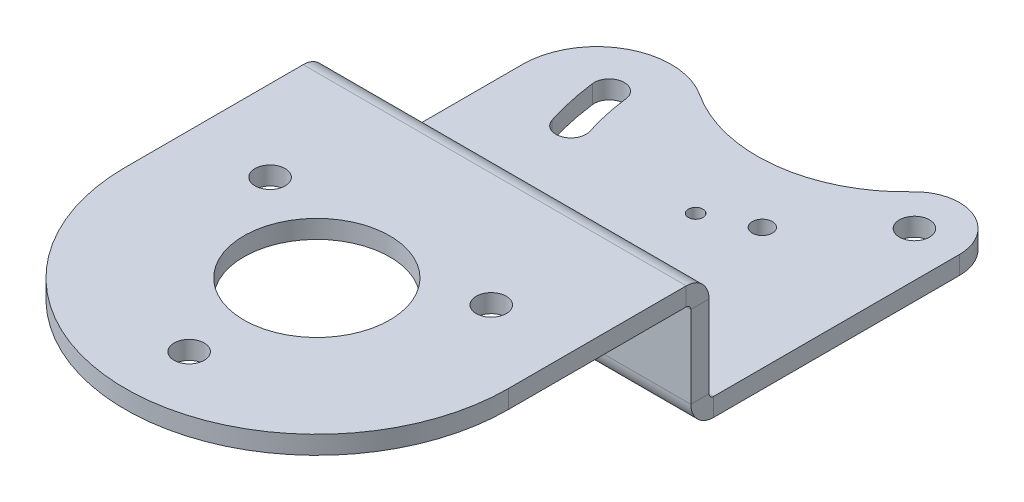
ISO-10303-21;
HEADER;
FILE_DESCRIPTION(('STEP AP214'),'2;1');
FILE_NAME('part.step','',(''),(''),'','','');
FILE_SCHEMA(('AUTOMOTIVE_DESIGN { 1 0 10303 214 1 1 1 1 }'));
ENDSEC;
DATA;
#1=APPLICATION_CONTEXT('core data for automotive mechanical design processes');
#2=APPLICATION_PROTOCOL_DEFINITION('international standard','automotive_design',2000,#1);
#3=PRODUCT_CONTEXT('',#1,'mechanical');
#4=PRODUCT('Part','Part','',(#3));
#5=PRODUCT_RELATED_PRODUCT_CATEGORY('part','',(#4));
#6=PRODUCT_DEFINITION_FORMATION('','',#4);
#7=PRODUCT_DEFINITION_CONTEXT('part definition',#1,'design');
#8=PRODUCT_DEFINITION('design','',#6,#7);
#9=PRODUCT_DEFINITION_SHAPE('','',#8);
#10=(LENGTH_UNIT() NAMED_UNIT(*) SI_UNIT(.MILLI.,.METRE.));
#11=(NAMED_UNIT(*) PLANE_ANGLE_UNIT() SI_UNIT($,.RADIAN.));
#12=(NAMED_UNIT(*) SI_UNIT($,.STERADIAN.) SOLID_ANGLE_UNIT());
#13=UNCERTAINTY_MEASURE_WITH_UNIT(LENGTH_MEASURE(1.E-05),#10,'distance_accuracy_value','');
#14=(GEOMETRIC_REPRESENTATION_CONTEXT(3) GLOBAL_UNCERTAINTY_ASSIGNED_CONTEXT((#13)) GLOBAL_UNIT_ASSIGNED_CONTEXT((#10,
#11,#12)) REPRESENTATION_CONTEXT('',''));
#15=CARTESIAN_POINT('',(0.,0.,0.));
#16=DIRECTION('',(0.,0.,1.));
#17=DIRECTION('',(1.,0.,0.));
#18=AXIS2_PLACEMENT_3D('',#15,#16,#17);
#19=CARTESIAN_POINT('',(21.,-14.,-22.));
#20=DIRECTION('',(-1.,0.,0.));
#21=DIRECTION('',(0.,0.,1.));
#22=AXIS2_PLACEMENT_3D('',#19,#20,#21);
#23=PLANE('',#22);
#24=DIRECTION('',(0.,1.,0.));
#25=VECTOR('',#24,1.);
#26=CARTESIAN_POINT('',(21.,-12.,-49.4549388473485));
#27=LINE('',#26,#25);
#28=CARTESIAN_POINT('',(21.,-12.,-49.4549388473485));
#29=VERTEX_POINT('',#28);
#30=CARTESIAN_POINT('',(21.,-14.,-49.4549388473485));
#31=VERTEX_POINT('',#30);
#32=EDGE_CURVE('E141',#29,#31,#27,.F.);
#33=ORIENTED_EDGE('',*,*,#32,.F.);
#34=DIRECTION('',(0.,0.,1.));
#35=VECTOR('',#34,1.);
#36=CARTESIAN_POINT('',(21.,-12.,-22.));
#37=LINE('',#36,#35);
#38=CARTESIAN_POINT('',(21.,-12.,-22.5));
#39=VERTEX_POINT('',#38);
#40=EDGE_CURVE('E173',#29,#39,#37,.T.);
#41=ORIENTED_EDGE('',*,*,#40,.T.);
#42=DIRECTION('',(0.,-1.,0.));
#43=VECTOR('',#42,1.);
#44=CARTESIAN_POINT('',(21.,-12.,-22.5));
#45=LINE('',#44,#43);
#46=CARTESIAN_POINT('',(21.,-14.,-22.5));
#47=VERTEX_POINT('',#46);
#48=EDGE_CURVE('E165',#39,#47,#45,.T.);
#49=ORIENTED_EDGE('',*,*,#48,.T.);
#50=DIRECTION('',(0.,0.,1.));
#51=VECTOR('',#50,1.);
#52=CARTESIAN_POINT('',(21.,-14.,-22.));
#53=LINE('',#52,#51);
#54=EDGE_CURVE('E158',#31,#47,#53,.T.);
#55=ORIENTED_EDGE('',*,*,#54,.F.);
#56=EDGE_LOOP('',(#33,#41,#49,#55));
#57=FACE_BOUND('',#56,.T.);
#58=ADVANCED_FACE('F17',(#57),#23,.F.);
#59=CARTESIAN_POINT('',(-21.,-14.,-22.));
#60=DIRECTION('',(0.,1.,0.));
#61=DIRECTION('',(0.,0.,1.));
#62=AXIS2_PLACEMENT_3D('',#59,#60,#61);
#63=PLANE('',#62);
#64=CARTESIAN_POINT('',(7.61949930145722,-14.,-41.2234289049806));
#65=DIRECTION('',(0.,1.,0.));
#66=DIRECTION('',(0.,0.,1.));
#67=AXIS2_PLACEMENT_3D('',#64,#65,#66);
#68=CIRCLE('',#67,1.09999999999997);
#69=CARTESIAN_POINT('',(7.61949930145722,-14.,-40.1234289049807));
#70=VERTEX_POINT('',#69);
#71=EDGE_CURVE('E619',#70,#70,#68,.T.);
#72=ORIENTED_EDGE('',*,*,#71,.T.);
#73=EDGE_LOOP('',(#72));
#74=FACE_BOUND('',#73,.T.);
#75=CARTESIAN_POINT('',(2.63480647275565,-14.,-38.8990284654068));
#76=DIRECTION('',(0.,1.,0.));
#77=DIRECTION('',(0.,0.,1.));
#78=AXIS2_PLACEMENT_3D('',#75,#76,#77);
#79=CIRCLE('',#78,0.799999999999989);
#80=CARTESIAN_POINT('',(2.63480647275565,-14.,-38.0990284654068));
#81=VERTEX_POINT('',#80);
#82=EDGE_CURVE('E623',#81,#81,#79,.T.);
#83=ORIENTED_EDGE('',*,*,#82,.T.);
#84=EDGE_LOOP('',(#83));
#85=FACE_BOUND('',#84,.T.);
#86=CARTESIAN_POINT('',(16.0688837074964,-14.,-49.4549388473485));
#87=DIRECTION('',(0.,1.,0.));
#88=DIRECTION('',(0.,0.,1.));
#89=AXIS2_PLACEMENT_3D('',#86,#87,#88);
#90=CIRCLE('',#89,1.65);
#91=CARTESIAN_POINT('',(16.0688837074964,-14.,-47.8049388473485));
#92=VERTEX_POINT('',#91);
#93=EDGE_CURVE('E673',#92,#92,#90,.T.);
#94=ORIENTED_EDGE('',*,*,#93,.T.);
#95=EDGE_LOOP('',(#94));
#96=FACE_BOUND('',#95,.T.);
#97=CARTESIAN_POINT('',(-13.7029628266318,-14.,-45.7620871107737));
#98=DIRECTION('',(0.,1.,0.));
#99=DIRECTION('',(0.,0.,1.));
#100=AXIS2_PLACEMENT_3D('',#97,#98,#99);
#101=CIRCLE('',#100,1.65);
#102=CARTESIAN_POINT('',(-12.0655112672547,-14.,-45.9651939562853));
#103=VERTEX_POINT('',#102);
#104=CARTESIAN_POINT('',(-15.3404143860089,-14.,-45.5589802652621));
#105=VERTEX_POINT('',#104);
#106=EDGE_CURVE('E651',#103,#105,#101,.T.);
#107=ORIENTED_EDGE('',*,*,#106,.T.);
#108=CARTESIAN_POINT('',(16.0688837074964,-14.,-49.4549388473485));
#109=DIRECTION('',(0.,1.,0.));
#110=DIRECTION('',(0.,0.,1.));
#111=AXIS2_PLACEMENT_3D('',#108,#109,#110);
#112=CIRCLE('',#111,31.65);
#113=CARTESIAN_POINT('',(-14.101311819247,-14.,-39.8903268908666));
#114=VERTEX_POINT('',#113);
#115=EDGE_CURVE('E643',#105,#114,#112,.T.);
#116=ORIENTED_EDGE('',*,*,#115,.T.);
#117=CARTESIAN_POINT('',(-12.528458024014,-14.,-40.3889559502093));
#118=DIRECTION('',(0.,1.,0.));
#119=DIRECTION('',(0.,0.,1.));
#120=AXIS2_PLACEMENT_3D('',#117,#118,#119);
#121=CIRCLE('',#120,1.65);
#122=CARTESIAN_POINT('',(-10.9556042287809,-14.,-40.8875850095519));
#123=VERTEX_POINT('',#122);
#124=EDGE_CURVE('E646',#114,#123,#121,.T.);
#125=ORIENTED_EDGE('',*,*,#124,.T.);
#126=CARTESIAN_POINT('',(16.0688837074964,-14.,-49.4549388473485));
#127=DIRECTION('',(0.,-1.,0.));
#128=DIRECTION('',(0.,0.,1.));
#129=AXIS2_PLACEMENT_3D('',#126,#127,#128);
#130=CIRCLE('',#129,28.35);
#131=EDGE_CURVE('E40',#123,#103,#130,.T.);
#132=ORIENTED_EDGE('',*,*,#131,.T.);
#133=EDGE_LOOP('',(#107,#116,#125,#132));
#134=FACE_BOUND('',#133,.T.);
#135=CARTESIAN_POINT('',(16.0688837074964,-14.,-49.4549388473485));
#136=DIRECTION('',(0.,-1.,0.));
#137=DIRECTION('',(0.,0.,-1.));
#138=AXIS2_PLACEMENT_3D('',#135,#136,#137);
#139=CIRCLE('',#138,4.93111629250366);
#140=CARTESIAN_POINT('',(12.4802044217859,-14.,-52.8368449481307));
#141=VERTEX_POINT('',#140);
#142=EDGE_CURVE('E145',#141,#31,#139,.T.);
#143=ORIENTED_EDGE('',*,*,#142,.T.);
#144=ORIENTED_EDGE('',*,*,#54,.T.);
#145=DIRECTION('',(1.,0.,0.));
#146=VECTOR('',#145,1.);
#147=CARTESIAN_POINT('',(-21.,-14.,-22.5));
#148=LINE('',#147,#146);
#149=CARTESIAN_POINT('',(-21.,-14.,-22.5));
#150=VERTEX_POINT('',#149);
#151=EDGE_CURVE('E180',#150,#47,#148,.T.);
#152=ORIENTED_EDGE('',*,*,#151,.F.);
#153=DIRECTION('',(0.,0.,-1.));
#154=VECTOR('',#153,1.);
#155=CARTESIAN_POINT('',(-21.,-14.,-70.));
#156=LINE('',#155,#154);
#157=CARTESIAN_POINT('',(-21.,-14.,-43.5542430095953));
#158=VERTEX_POINT('',#157);
#159=EDGE_CURVE('E167',#150,#158,#156,.T.);
#160=ORIENTED_EDGE('',*,*,#159,.T.);
#161=CARTESIAN_POINT('',(-12.8510606600122,-14.,-43.5542430095953));
#162=DIRECTION('',(0.,-1.,0.));
#163=DIRECTION('',(0.,0.,-1.));
#164=AXIS2_PLACEMENT_3D('',#161,#162,#163);
#165=CIRCLE('',#164,8.14893933998781);
#166=CARTESIAN_POINT('',(-8.38641685903616,-14.,-50.3712928185088));
#167=VERTEX_POINT('',#166);
#168=EDGE_CURVE('E631',#158,#167,#165,.T.);
#169=ORIENTED_EDGE('',*,*,#168,.T.);
#170=CARTESIAN_POINT('',(0.575665220033303,-14.,-64.0554662146556));
#171=DIRECTION('',(0.,1.,0.));
#172=DIRECTION('',(0.,0.,1.));
#173=AXIS2_PLACEMENT_3D('',#170,#171,#172);
#174=CIRCLE('',#173,16.3577356846169);
#175=EDGE_CURVE('E161',#167,#141,#174,.T.);
#176=ORIENTED_EDGE('',*,*,#175,.T.);
#177=EDGE_LOOP('',(#143,#144,#152,#160,#169,#176));
#178=FACE_BOUND('',#177,.T.);
#179=ADVANCED_FACE('F156',(#74,#85,#96,#134,#178),#63,.F.);
#180=CARTESIAN_POINT('',(-21.,-12.,-22.));
#181=DIRECTION('',(0.,1.,0.));
#182=DIRECTION('',(0.,0.,1.));
#183=AXIS2_PLACEMENT_3D('',#180,#181,#182);
#184=PLANE('',#183);
#185=CARTESIAN_POINT('',(7.61949930145722,-12.,-41.2234289049806));
#186=DIRECTION('',(0.,1.,0.));
#187=DIRECTION('',(0.,0.,1.));
#188=AXIS2_PLACEMENT_3D('',#185,#186,#187);
#189=CIRCLE('',#188,1.09999999999998);
#190=CARTESIAN_POINT('',(7.61949930145722,-12.,-40.1234289049807));
#191=VERTEX_POINT('',#190);
#192=EDGE_CURVE('E616',#191,#191,#189,.T.);
#193=ORIENTED_EDGE('',*,*,#192,.F.);
#194=EDGE_LOOP('',(#193));
#195=FACE_BOUND('',#194,.T.);
#196=CARTESIAN_POINT('',(2.63480647275565,-12.,-38.8990284654068));
#197=DIRECTION('',(0.,1.,0.));
#198=DIRECTION('',(0.,0.,1.));
#199=AXIS2_PLACEMENT_3D('',#196,#197,#198);
#200=CIRCLE('',#199,0.79999999999999);
#201=CARTESIAN_POINT('',(2.63480647275565,-12.,-38.0990284654068));
#202=VERTEX_POINT('',#201);
#203=EDGE_CURVE('E620',#202,#202,#200,.T.);
#204=ORIENTED_EDGE('',*,*,#203,.F.);
#205=EDGE_LOOP('',(#204));
#206=FACE_BOUND('',#205,.T.);
#207=CARTESIAN_POINT('',(16.0688837074964,-12.,-49.4549388473485));
#208=DIRECTION('',(0.,1.,0.));
#209=DIRECTION('',(0.,0.,1.));
#210=AXIS2_PLACEMENT_3D('',#207,#208,#209);
#211=CIRCLE('',#210,1.65);
#212=CARTESIAN_POINT('',(16.0688837074964,-12.,-47.8049388473485));
#213=VERTEX_POINT('',#212);
#214=EDGE_CURVE('E666',#213,#213,#211,.T.);
#215=ORIENTED_EDGE('',*,*,#214,.F.);
#216=EDGE_LOOP('',(#215));
#217=FACE_BOUND('',#216,.T.);
#218=CARTESIAN_POINT('',(16.0688837074964,-12.,-49.4549388473485));
#219=DIRECTION('',(0.,1.,0.));
#220=DIRECTION('',(0.,0.,1.));
#221=AXIS2_PLACEMENT_3D('',#218,#219,#220);
#222=CIRCLE('',#221,31.65);
#223=CARTESIAN_POINT('',(-15.3404143860089,-12.,-45.5589802652621));
#224=VERTEX_POINT('',#223);
#225=CARTESIAN_POINT('',(-14.101311819247,-12.,-39.8903268908666));
#226=VERTEX_POINT('',#225);
#227=EDGE_CURVE('E641',#224,#226,#222,.T.);
#228=ORIENTED_EDGE('',*,*,#227,.F.);
#229=CARTESIAN_POINT('',(-13.7029628266318,-12.,-45.7620871107737));
#230=DIRECTION('',(0.,1.,0.));
#231=DIRECTION('',(0.,0.,1.));
#232=AXIS2_PLACEMENT_3D('',#229,#230,#231);
#233=CIRCLE('',#232,1.65);
#234=CARTESIAN_POINT('',(-12.0655112672547,-12.,-45.9651939562853));
#235=VERTEX_POINT('',#234);
#236=EDGE_CURVE('E647',#235,#224,#233,.T.);
#237=ORIENTED_EDGE('',*,*,#236,.F.);
#238=CARTESIAN_POINT('',(16.0688837074964,-12.,-49.4549388473485));
#239=DIRECTION('',(0.,-1.,0.));
#240=DIRECTION('',(0.,0.,1.));
#241=AXIS2_PLACEMENT_3D('',#238,#239,#240);
#242=CIRCLE('',#241,28.35);
#243=CARTESIAN_POINT('',(-10.9556042287809,-12.,-40.8875850095519));
#244=VERTEX_POINT('',#243);
#245=EDGE_CURVE('E659',#244,#235,#242,.T.);
#246=ORIENTED_EDGE('',*,*,#245,.F.);
#247=CARTESIAN_POINT('',(-12.528458024014,-12.,-40.3889559502093));
#248=DIRECTION('',(0.,1.,0.));
#249=DIRECTION('',(0.,0.,1.));
#250=AXIS2_PLACEMENT_3D('',#247,#248,#249);
#251=CIRCLE('',#250,1.65);
#252=EDGE_CURVE('E656',#226,#244,#251,.T.);
#253=ORIENTED_EDGE('',*,*,#252,.F.);
#254=EDGE_LOOP('',(#228,#237,#246,#253));
#255=FACE_BOUND('',#254,.T.);
#256=ORIENTED_EDGE('',*,*,#40,.F.);
#257=CARTESIAN_POINT('',(16.0688837074964,-12.,-49.4549388473485));
#258=DIRECTION('',(0.,-1.,0.));
#259=DIRECTION('',(0.,0.,1.));
#260=AXIS2_PLACEMENT_3D('',#257,#258,#259);
#261=CIRCLE('',#260,4.93111629250366);
#262=CARTESIAN_POINT('',(12.4802044217859,-12.,-52.8368449481307));
#263=VERTEX_POINT('',#262);
#264=EDGE_CURVE('E148',#263,#29,#261,.T.);
#265=ORIENTED_EDGE('',*,*,#264,.F.);
#266=CARTESIAN_POINT('',(0.575665220033303,-12.,-64.0554662146556));
#267=DIRECTION('',(0.,1.,0.));
#268=DIRECTION('',(0.,0.,1.));
#269=AXIS2_PLACEMENT_3D('',#266,#267,#268);
#270=CIRCLE('',#269,16.3577356846169);
#271=CARTESIAN_POINT('',(-8.38641685903616,-12.,-50.3712928185088));
#272=VERTEX_POINT('',#271);
#273=EDGE_CURVE('E634',#272,#263,#270,.T.);
#274=ORIENTED_EDGE('',*,*,#273,.F.);
#275=CARTESIAN_POINT('',(-12.8510606600122,-12.,-43.5542430095953));
#276=DIRECTION('',(0.,-1.,0.));
#277=DIRECTION('',(0.,0.,1.));
#278=AXIS2_PLACEMENT_3D('',#275,#276,#277);
#279=CIRCLE('',#278,8.14893933998781);
#280=CARTESIAN_POINT('',(-21.,-12.,-43.5542430095953));
#281=VERTEX_POINT('',#280);
#282=EDGE_CURVE('E628',#281,#272,#279,.T.);
#283=ORIENTED_EDGE('',*,*,#282,.F.);
#284=DIRECTION('',(0.,0.,-1.));
#285=VECTOR('',#284,1.);
#286=CARTESIAN_POINT('',(-21.,-12.,-70.));
#287=LINE('',#286,#285);
#288=CARTESIAN_POINT('',(-21.,-12.,-22.5));
#289=VERTEX_POINT('',#288);
#290=EDGE_CURVE('E177',#289,#281,#287,.T.);
#291=ORIENTED_EDGE('',*,*,#290,.F.);
#292=DIRECTION('',(-1.,0.,0.));
#293=VECTOR('',#292,1.);
#294=CARTESIAN_POINT('',(21.,-12.,-22.5));
#295=LINE('',#294,#293);
#296=EDGE_CURVE('E678',#39,#289,#295,.T.);
#297=ORIENTED_EDGE('',*,*,#296,.F.);
#298=EDGE_LOOP('',(#256,#265,#274,#283,#291,#297));
#299=FACE_BOUND('',#298,.T.);
#300=ADVANCED_FACE('F330',(#195,#206,#217,#255,#299),#184,.T.);
#301=CARTESIAN_POINT('',(21.,-12.,-22.));
#302=DIRECTION('',(-1.,0.,0.));
#303=DIRECTION('',(0.,0.,1.));
#304=AXIS2_PLACEMENT_3D('',#301,#302,#303);
#305=PLANE('',#304);
#306=DIRECTION('',(0.,0.,1.));
#307=VECTOR('',#306,1.);
#308=CARTESIAN_POINT('',(21.,-11.5,-22.));
#309=LINE('',#308,#307);
#310=CARTESIAN_POINT('',(21.,-11.5,-22.));
#311=VERTEX_POINT('',#310);
#312=CARTESIAN_POINT('',(21.,-11.5,-20.));
#313=VERTEX_POINT('',#312);
#314=EDGE_CURVE('E196',#311,#313,#309,.T.);
#315=ORIENTED_EDGE('',*,*,#314,.F.);
#316=DIRECTION('',(0.,-1.,0.));
#317=VECTOR('',#316,1.);
#318=CARTESIAN_POINT('',(21.,-12.,-22.));
#319=LINE('',#318,#317);
#320=CARTESIAN_POINT('',(21.,-2.5,-22.));
#321=VERTEX_POINT('',#320);
#322=EDGE_CURVE('E213',#321,#311,#319,.T.);
#323=ORIENTED_EDGE('',*,*,#322,.F.);
#324=DIRECTION('',(0.,0.,-1.));
#325=VECTOR('',#324,1.);
#326=CARTESIAN_POINT('',(21.,-2.5,-20.));
#327=LINE('',#326,#325);
#328=CARTESIAN_POINT('',(21.,-2.5,-20.));
#329=VERTEX_POINT('',#328);
#330=EDGE_CURVE('E204',#329,#321,#327,.T.);
#331=ORIENTED_EDGE('',*,*,#330,.F.);
#332=DIRECTION('',(0.,-1.,0.));
#333=VECTOR('',#332,1.);
#334=CARTESIAN_POINT('',(21.,-12.,-20.));
#335=LINE('',#334,#333);
#336=EDGE_CURVE('E212',#329,#313,#335,.T.);
#337=ORIENTED_EDGE('',*,*,#336,.T.);
#338=EDGE_LOOP('',(#315,#323,#331,#337));
#339=FACE_BOUND('',#338,.T.);
#340=ADVANCED_FACE('F366',(#339),#305,.F.);
#341=CARTESIAN_POINT('',(-21.,-2.,-22.));
#342=DIRECTION('',(1.,0.,0.));
#343=DIRECTION('',(0.,0.,-1.));
#344=AXIS2_PLACEMENT_3D('',#341,#342,#343);
#345=PLANE('',#344);
#346=DIRECTION('',(0.,0.,1.));
#347=VECTOR('',#346,1.);
#348=CARTESIAN_POINT('',(-21.,-11.5,-22.));
#349=LINE('',#348,#347);
#350=CARTESIAN_POINT('',(-21.,-11.5,-22.));
#351=VERTEX_POINT('',#350);
#352=CARTESIAN_POINT('',(-21.,-11.5,-20.));
#353=VERTEX_POINT('',#352);
#354=EDGE_CURVE('E189',#351,#353,#349,.T.);
#355=ORIENTED_EDGE('',*,*,#354,.T.);
#356=DIRECTION('',(0.,1.,0.));
#357=VECTOR('',#356,1.);
#358=CARTESIAN_POINT('',(-21.,-2.,-20.));
#359=LINE('',#358,#357);
#360=CARTESIAN_POINT('',(-21.,-2.5,-20.));
#361=VERTEX_POINT('',#360);
#362=EDGE_CURVE('E217',#353,#361,#359,.T.);
#363=ORIENTED_EDGE('',*,*,#362,.T.);
#364=DIRECTION('',(0.,0.,-1.));
#365=VECTOR('',#364,1.);
#366=CARTESIAN_POINT('',(-21.,-2.5,-20.));
#367=LINE('',#366,#365);
#368=CARTESIAN_POINT('',(-21.,-2.5,-22.));
#369=VERTEX_POINT('',#368);
#370=EDGE_CURVE('E199',#361,#369,#367,.T.);
#371=ORIENTED_EDGE('',*,*,#370,.T.);
#372=DIRECTION('',(0.,1.,0.));
#373=VECTOR('',#372,1.);
#374=CARTESIAN_POINT('',(-21.,-2.,-22.));
#375=LINE('',#374,#373);
#376=EDGE_CURVE('E216',#351,#369,#375,.T.);
#377=ORIENTED_EDGE('',*,*,#376,.F.);
#378=EDGE_LOOP('',(#355,#363,#371,#377));
#379=FACE_BOUND('',#378,.T.);
#380=ADVANCED_FACE('F359',(#379),#345,.F.);
#381=CARTESIAN_POINT('',(21.,-2.,-22.));
#382=DIRECTION('',(0.,0.,1.));
#383=DIRECTION('',(0.,-1.,0.));
#384=AXIS2_PLACEMENT_3D('',#381,#382,#383);
#385=PLANE('',#384);
#386=DIRECTION('',(-1.,0.,0.));
#387=VECTOR('',#386,1.);
#388=CARTESIAN_POINT('',(-21.,-11.5,-22.));
#389=LINE('',#388,#387);
#390=EDGE_CURVE('E170',#351,#311,#389,.F.);
#391=ORIENTED_EDGE('',*,*,#390,.F.);
#392=ORIENTED_EDGE('',*,*,#376,.T.);
#393=DIRECTION('',(-1.,0.,0.));
#394=VECTOR('',#393,1.);
#395=CARTESIAN_POINT('',(21.,-2.5,-22.));
#396=LINE('',#395,#394);
#397=EDGE_CURVE('E207',#321,#369,#396,.T.);
#398=ORIENTED_EDGE('',*,*,#397,.F.);
#399=ORIENTED_EDGE('',*,*,#322,.T.);
#400=EDGE_LOOP('',(#391,#392,#398,#399));
#401=FACE_BOUND('',#400,.T.);
#402=ADVANCED_FACE('F356',(#401),#385,.F.);
#403=CARTESIAN_POINT('',(21.,-2.,-20.));
#404=DIRECTION('',(0.,0.,1.));
#405=DIRECTION('',(0.,-1.,0.));
#406=AXIS2_PLACEMENT_3D('',#403,#404,#405);
#407=PLANE('',#406);
#408=ORIENTED_EDGE('',*,*,#362,.F.);
#409=DIRECTION('',(-1.,0.,0.));
#410=VECTOR('',#409,1.);
#411=CARTESIAN_POINT('',(-21.,-11.5,-20.));
#412=LINE('',#411,#410);
#413=EDGE_CURVE('E182',#353,#313,#412,.F.);
#414=ORIENTED_EDGE('',*,*,#413,.T.);
#415=ORIENTED_EDGE('',*,*,#336,.F.);
#416=DIRECTION('',(1.,0.,0.));
#417=VECTOR('',#416,1.);
#418=CARTESIAN_POINT('',(-21.,-2.5,-20.));
#419=LINE('',#418,#417);
#420=EDGE_CURVE('E202',#361,#329,#419,.T.);
#421=ORIENTED_EDGE('',*,*,#420,.F.);
#422=EDGE_LOOP('',(#408,#414,#415,#421));
#423=FACE_BOUND('',#422,.T.);
#424=ADVANCED_FACE('F321',(#423),#407,.T.);
#425=CARTESIAN_POINT('',(21.,-2.,-20.));
#426=DIRECTION('',(1.,0.,0.));
#427=DIRECTION('',(0.,0.,-1.));
#428=AXIS2_PLACEMENT_3D('',#425,#426,#427);
#429=PLANE('',#428);
#430=DIRECTION('',(0.,0.,-1.));
#431=VECTOR('',#430,1.);
#432=CARTESIAN_POINT('',(21.,-2.,-20.));
#433=LINE('',#432,#431);
#434=CARTESIAN_POINT('',(21.,-2.,0.));
#435=VERTEX_POINT('',#434);
#436=CARTESIAN_POINT('',(21.,-2.,-19.5));
#437=VERTEX_POINT('',#436);
#438=EDGE_CURVE('E273',#435,#437,#433,.T.);
#439=ORIENTED_EDGE('',*,*,#438,.T.);
#440=DIRECTION('',(0.,1.,0.));
#441=VECTOR('',#440,1.);
#442=CARTESIAN_POINT('',(21.,-2.,-19.5));
#443=LINE('',#442,#441);
#444=CARTESIAN_POINT('',(21.,0.,-19.5));
#445=VERTEX_POINT('',#444);
#446=EDGE_CURVE('E230',#437,#445,#443,.T.);
#447=ORIENTED_EDGE('',*,*,#446,.T.);
#448=DIRECTION('',(0.,0.,-1.));
#449=VECTOR('',#448,1.);
#450=CARTESIAN_POINT('',(21.,0.,-20.));
#451=LINE('',#450,#449);
#452=CARTESIAN_POINT('',(21.,0.,0.));
#453=VERTEX_POINT('',#452);
#454=EDGE_CURVE('E281',#453,#445,#451,.T.);
#455=ORIENTED_EDGE('',*,*,#454,.F.);
#456=DIRECTION('',(0.,1.,0.));
#457=VECTOR('',#456,1.);
#458=CARTESIAN_POINT('',(21.,-2.,0.));
#459=LINE('',#458,#457);
#460=EDGE_CURVE('E21',#435,#453,#459,.T.);
#461=ORIENTED_EDGE('',*,*,#460,.F.);
#462=EDGE_LOOP('',(#439,#447,#455,#461));
#463=FACE_BOUND('',#462,.T.);
#464=ADVANCED_FACE('F298',(#463),#429,.T.);
#465=CARTESIAN_POINT('',(0.,-2.,0.));
#466=DIRECTION('',(0.,1.,0.));
#467=DIRECTION('',(0.,0.,1.));
#468=AXIS2_PLACEMENT_3D('',#465,#466,#467);
#469=PLANE('',#468);
#470=CARTESIAN_POINT('',(0.,-2.,0.));
#471=DIRECTION('',(0.,1.,0.));
#472=DIRECTION('',(0.,0.,1.));
#473=AXIS2_PLACEMENT_3D('',#470,#471,#472);
#474=CIRCLE('',#473,8.);
#475=CARTESIAN_POINT('',(0.,-2.,8.));
#476=VERTEX_POINT('',#475);
#477=EDGE_CURVE('E264',#476,#476,#474,.T.);
#478=ORIENTED_EDGE('',*,*,#477,.T.);
#479=EDGE_LOOP('',(#478));
#480=FACE_BOUND('',#479,.T.);
#481=CARTESIAN_POINT('',(0.,-2.,14.));
#482=DIRECTION('',(0.,1.,0.));
#483=DIRECTION('',(0.,0.,1.));
#484=AXIS2_PLACEMENT_3D('',#481,#482,#483);
#485=CIRCLE('',#484,1.65);
#486=CARTESIAN_POINT('',(0.,-2.,15.65));
#487=VERTEX_POINT('',#486);
#488=EDGE_CURVE('E260',#487,#487,#485,.T.);
#489=ORIENTED_EDGE('',*,*,#488,.T.);
#490=EDGE_LOOP('',(#489));
#491=FACE_BOUND('',#490,.T.);
#492=CARTESIAN_POINT('',(12.1243556529822,-2.,-6.99999999999989));
#493=DIRECTION('',(0.,1.,0.));
#494=DIRECTION('',(0.,0.,1.));
#495=AXIS2_PLACEMENT_3D('',#492,#493,#494);
#496=CIRCLE('',#495,1.65);
#497=CARTESIAN_POINT('',(12.1243556529822,-2.,-5.34999999999989));
#498=VERTEX_POINT('',#497);
#499=EDGE_CURVE('E254',#498,#498,#496,.T.);
#500=ORIENTED_EDGE('',*,*,#499,.T.);
#501=EDGE_LOOP('',(#500));
#502=FACE_BOUND('',#501,.T.);
#503=CARTESIAN_POINT('',(-12.1243556529821,-2.,-7.));
#504=DIRECTION('',(0.,1.,0.));
#505=DIRECTION('',(0.,0.,1.));
#506=AXIS2_PLACEMENT_3D('',#503,#504,#505);
#507=CIRCLE('',#506,1.65);
#508=CARTESIAN_POINT('',(-12.1243556529821,-2.,-5.35));
#509=VERTEX_POINT('',#508);
#510=EDGE_CURVE('E248',#509,#509,#507,.T.);
#511=ORIENTED_EDGE('',*,*,#510,.T.);
#512=EDGE_LOOP('',(#511));
#513=FACE_BOUND('',#512,.T.);
#514=DIRECTION('',(1.,0.,0.));
#515=VECTOR('',#514,1.);
#516=CARTESIAN_POINT('',(21.,-2.,-19.5));
#517=LINE('',#516,#515);
#518=CARTESIAN_POINT('',(-21.,-2.,-19.5));
#519=VERTEX_POINT('',#518);
#520=EDGE_CURVE('E236',#437,#519,#517,.F.);
#521=ORIENTED_EDGE('',*,*,#520,.F.);
#522=ORIENTED_EDGE('',*,*,#438,.F.);
#523=CARTESIAN_POINT('',(0.,-2.,0.));
#524=DIRECTION('',(0.,1.,0.));
#525=DIRECTION('',(0.,0.,1.));
#526=AXIS2_PLACEMENT_3D('',#523,#524,#525);
#527=CIRCLE('',#526,21.);
#528=CARTESIAN_POINT('',(-21.,-2.,0.));
#529=VERTEX_POINT('',#528);
#530=EDGE_CURVE('E270',#529,#435,#527,.T.);
#531=ORIENTED_EDGE('',*,*,#530,.F.);
#532=DIRECTION('',(0.,0.,1.));
#533=VECTOR('',#532,1.);
#534=CARTESIAN_POINT('',(-21.,-2.,0.));
#535=LINE('',#534,#533);
#536=EDGE_CURVE('E277',#519,#529,#535,.T.);
#537=ORIENTED_EDGE('',*,*,#536,.F.);
#538=EDGE_LOOP('',(#521,#522,#531,#537));
#539=FACE_BOUND('',#538,.T.);
#540=ADVANCED_FACE('F309',(#480,#491,#502,#513,#539),#469,.F.);
#541=CARTESIAN_POINT('',(0.,0.,0.));
#542=DIRECTION('',(0.,1.,0.));
#543=DIRECTION('',(0.,0.,1.));
#544=AXIS2_PLACEMENT_3D('',#541,#542,#543);
#545=PLANE('',#544);
#546=CARTESIAN_POINT('',(0.,0.,0.));
#547=DIRECTION('',(0.,1.,0.));
#548=DIRECTION('',(0.,0.,1.));
#549=AXIS2_PLACEMENT_3D('',#546,#547,#548);
#550=CIRCLE('',#549,8.);
#551=CARTESIAN_POINT('',(0.,0.,8.));
#552=VERTEX_POINT('',#551);
#553=EDGE_CURVE('E263',#552,#552,#550,.T.);
#554=ORIENTED_EDGE('',*,*,#553,.F.);
#555=EDGE_LOOP('',(#554));
#556=FACE_BOUND('',#555,.T.);
#557=CARTESIAN_POINT('',(0.,0.,14.));
#558=DIRECTION('',(0.,1.,0.));
#559=DIRECTION('',(0.,0.,1.));
#560=AXIS2_PLACEMENT_3D('',#557,#558,#559);
#561=CIRCLE('',#560,1.65);
#562=CARTESIAN_POINT('',(0.,0.,15.65));
#563=VERTEX_POINT('',#562);
#564=EDGE_CURVE('E257',#563,#563,#561,.T.);
#565=ORIENTED_EDGE('',*,*,#564,.F.);
#566=EDGE_LOOP('',(#565));
#567=FACE_BOUND('',#566,.T.);
#568=CARTESIAN_POINT('',(12.1243556529822,0.,-6.99999999999989));
#569=DIRECTION('',(0.,1.,0.));
#570=DIRECTION('',(0.,0.,1.));
#571=AXIS2_PLACEMENT_3D('',#568,#569,#570);
#572=CIRCLE('',#571,1.65);
#573=CARTESIAN_POINT('',(12.1243556529822,0.,-5.34999999999989));
#574=VERTEX_POINT('',#573);
#575=EDGE_CURVE('E251',#574,#574,#572,.T.);
#576=ORIENTED_EDGE('',*,*,#575,.F.);
#577=EDGE_LOOP('',(#576));
#578=FACE_BOUND('',#577,.T.);
#579=CARTESIAN_POINT('',(-12.1243556529821,0.,-7.));
#580=DIRECTION('',(0.,1.,0.));
#581=DIRECTION('',(0.,0.,1.));
#582=AXIS2_PLACEMENT_3D('',#579,#580,#581);
#583=CIRCLE('',#582,1.65);
#584=CARTESIAN_POINT('',(-12.1243556529821,0.,-5.35));
#585=VERTEX_POINT('',#584);
#586=EDGE_CURVE('E243',#585,#585,#583,.T.);
#587=ORIENTED_EDGE('',*,*,#586,.F.);
#588=EDGE_LOOP('',(#587));
#589=FACE_BOUND('',#588,.T.);
#590=ORIENTED_EDGE('',*,*,#454,.T.);
#591=DIRECTION('',(1.,0.,0.));
#592=VECTOR('',#591,1.);
#593=CARTESIAN_POINT('',(21.,0.,-19.5));
#594=LINE('',#593,#592);
#595=CARTESIAN_POINT('',(-21.,0.,-19.5));
#596=VERTEX_POINT('',#595);
#597=EDGE_CURVE('E223',#445,#596,#594,.F.);
#598=ORIENTED_EDGE('',*,*,#597,.T.);
#599=DIRECTION('',(0.,0.,1.));
#600=VECTOR('',#599,1.);
#601=CARTESIAN_POINT('',(-21.,0.,0.));
#602=LINE('',#601,#600);
#603=CARTESIAN_POINT('',(-21.,0.,0.));
#604=VERTEX_POINT('',#603);
#605=EDGE_CURVE('E274',#596,#604,#602,.T.);
#606=ORIENTED_EDGE('',*,*,#605,.T.);
#607=CARTESIAN_POINT('',(0.,0.,0.));
#608=DIRECTION('',(0.,1.,0.));
#609=DIRECTION('',(0.,0.,1.));
#610=AXIS2_PLACEMENT_3D('',#607,#608,#609);
#611=CIRCLE('',#610,21.);
#612=EDGE_CURVE('E267',#604,#453,#611,.T.);
#613=ORIENTED_EDGE('',*,*,#612,.T.);
#614=EDGE_LOOP('',(#590,#598,#606,#613));
#615=FACE_BOUND('',#614,.T.);
#616=ADVANCED_FACE('F286',(#556,#567,#578,#589,#615),#545,.T.);
#617=CARTESIAN_POINT('',(0.,-2.,0.));
#618=DIRECTION('',(0.,1.,0.));
#619=DIRECTION('',(0.,0.,1.));
#620=AXIS2_PLACEMENT_3D('',#617,#618,#619);
#621=CYLINDRICAL_SURFACE('',#620,21.);
#622=ORIENTED_EDGE('',*,*,#612,.F.);
#623=DIRECTION('',(0.,1.,0.));
#624=VECTOR('',#623,1.);
#625=CARTESIAN_POINT('',(-21.,-2.,0.));
#626=LINE('',#625,#624);
#627=EDGE_CURVE('E11',#529,#604,#626,.T.);
#628=ORIENTED_EDGE('',*,*,#627,.F.);
#629=ORIENTED_EDGE('',*,*,#530,.T.);
#630=ORIENTED_EDGE('',*,*,#460,.T.);
#631=EDGE_LOOP('',(#622,#628,#629,#630));
#632=FACE_BOUND('',#631,.T.);
#633=ADVANCED_FACE('F19',(#632),#621,.T.);
#634=CARTESIAN_POINT('',(-21.,-2.,0.));
#635=DIRECTION('',(-1.,0.,0.));
#636=DIRECTION('',(0.,0.,1.));
#637=AXIS2_PLACEMENT_3D('',#634,#635,#636);
#638=PLANE('',#637);
#639=DIRECTION('',(0.,1.,0.));
#640=VECTOR('',#639,1.);
#641=CARTESIAN_POINT('',(-21.,-2.,-19.5));
#642=LINE('',#641,#640);
#643=EDGE_CURVE('E240',#519,#596,#642,.T.);
#644=ORIENTED_EDGE('',*,*,#643,.F.);
#645=ORIENTED_EDGE('',*,*,#536,.T.);
#646=ORIENTED_EDGE('',*,*,#627,.T.);
#647=ORIENTED_EDGE('',*,*,#605,.F.);
#648=EDGE_LOOP('',(#644,#645,#646,#647));
#649=FACE_BOUND('',#648,.T.);
#650=ADVANCED_FACE('F291',(#649),#638,.T.);
#651=CARTESIAN_POINT('',(0.,-2.,0.));
#652=DIRECTION('',(0.,1.,0.));
#653=DIRECTION('',(0.,0.,1.));
#654=AXIS2_PLACEMENT_3D('',#651,#652,#653);
#655=CYLINDRICAL_SURFACE('',#654,8.);
#656=ORIENTED_EDGE('',*,*,#477,.F.);
#657=EDGE_LOOP('',(#656));
#658=FACE_BOUND('',#657,.T.);
#659=ORIENTED_EDGE('',*,*,#553,.T.);
#660=EDGE_LOOP('',(#659));
#661=FACE_BOUND('',#660,.T.);
#662=ADVANCED_FACE('F393',(#658,#661),#655,.F.);
#663=CARTESIAN_POINT('',(0.,0.,14.));
#664=DIRECTION('',(0.,1.,0.));
#665=DIRECTION('',(0.,0.,1.));
#666=AXIS2_PLACEMENT_3D('',#663,#664,#665);
#667=CYLINDRICAL_SURFACE('',#666,1.65);
#668=ORIENTED_EDGE('',*,*,#564,.T.);
#669=EDGE_LOOP('',(#668));
#670=FACE_BOUND('',#669,.T.);
#671=ORIENTED_EDGE('',*,*,#488,.F.);
#672=EDGE_LOOP('',(#671));
#673=FACE_BOUND('',#672,.T.);
#674=ADVANCED_FACE('F390',(#670,#673),#667,.F.);
#675=CARTESIAN_POINT('',(12.1243556529822,0.,-6.99999999999989));
#676=DIRECTION('',(0.,1.,0.));
#677=DIRECTION('',(0.,0.,1.));
#678=AXIS2_PLACEMENT_3D('',#675,#676,#677);
#679=CYLINDRICAL_SURFACE('',#678,1.65);
#680=ORIENTED_EDGE('',*,*,#575,.T.);
#681=EDGE_LOOP('',(#680));
#682=FACE_BOUND('',#681,.T.);
#683=ORIENTED_EDGE('',*,*,#499,.F.);
#684=EDGE_LOOP('',(#683));
#685=FACE_BOUND('',#684,.T.);
#686=ADVANCED_FACE('F386',(#682,#685),#679,.F.);
#687=CARTESIAN_POINT('',(-12.1243556529821,0.,-7.));
#688=DIRECTION('',(0.,1.,0.));
#689=DIRECTION('',(0.,0.,1.));
#690=AXIS2_PLACEMENT_3D('',#687,#688,#689);
#691=CYLINDRICAL_SURFACE('',#690,1.65);
#692=ORIENTED_EDGE('',*,*,#586,.T.);
#693=EDGE_LOOP('',(#692));
#694=FACE_BOUND('',#693,.T.);
#695=ORIENTED_EDGE('',*,*,#510,.F.);
#696=EDGE_LOOP('',(#695));
#697=FACE_BOUND('',#696,.T.);
#698=ADVANCED_FACE('F380',(#694,#697),#691,.F.);
#699=CARTESIAN_POINT('',(-21.,-2.5,-19.5));
#700=DIRECTION('',(-1.,0.,0.));
#701=DIRECTION('',(0.,0.,1.));
#702=AXIS2_PLACEMENT_3D('',#699,#700,#701);
#703=PLANE('',#702);
#704=ORIENTED_EDGE('',*,*,#370,.F.);
#705=CARTESIAN_POINT('',(-21.,-2.5,-19.5));
#706=DIRECTION('',(1.,0.,0.));
#707=DIRECTION('',(0.,0.,-1.));
#708=AXIS2_PLACEMENT_3D('',#705,#706,#707);
#709=CIRCLE('',#708,0.5);
#710=EDGE_CURVE('E233',#519,#361,#709,.F.);
#711=ORIENTED_EDGE('',*,*,#710,.F.);
#712=ORIENTED_EDGE('',*,*,#643,.T.);
#713=CARTESIAN_POINT('',(-21.,-2.5,-19.5));
#714=DIRECTION('',(1.,0.,0.));
#715=DIRECTION('',(0.,0.,-1.));
#716=AXIS2_PLACEMENT_3D('',#713,#714,#715);
#717=CIRCLE('',#716,2.5);
#718=EDGE_CURVE('E226',#596,#369,#717,.F.);
#719=ORIENTED_EDGE('',*,*,#718,.T.);
#720=EDGE_LOOP('',(#704,#711,#712,#719));
#721=FACE_BOUND('',#720,.T.);
#722=ADVANCED_FACE('F377',(#721),#703,.T.);
#723=CARTESIAN_POINT('',(21.,-2.5,-19.5));
#724=DIRECTION('',(-1.,0.,0.));
#725=DIRECTION('',(0.,0.,1.));
#726=AXIS2_PLACEMENT_3D('',#723,#724,#725);
#727=PLANE('',#726);
#728=CARTESIAN_POINT('',(21.,-2.5,-19.5));
#729=DIRECTION('',(1.,0.,0.));
#730=DIRECTION('',(0.,0.,-1.));
#731=AXIS2_PLACEMENT_3D('',#728,#729,#730);
#732=CIRCLE('',#731,0.5);
#733=EDGE_CURVE('E219',#329,#437,#732,.T.);
#734=ORIENTED_EDGE('',*,*,#733,.F.);
#735=ORIENTED_EDGE('',*,*,#330,.T.);
#736=CARTESIAN_POINT('',(21.,-2.5,-19.5));
#737=DIRECTION('',(1.,0.,0.));
#738=DIRECTION('',(0.,0.,-1.));
#739=AXIS2_PLACEMENT_3D('',#736,#737,#738);
#740=CIRCLE('',#739,2.5);
#741=EDGE_CURVE('E227',#321,#445,#740,.T.);
#742=ORIENTED_EDGE('',*,*,#741,.T.);
#743=ORIENTED_EDGE('',*,*,#446,.F.);
#744=EDGE_LOOP('',(#734,#735,#742,#743));
#745=FACE_BOUND('',#744,.T.);
#746=ADVANCED_FACE('F301',(#745),#727,.F.);
#747=CARTESIAN_POINT('',(21.,-2.5,-19.5));
#748=DIRECTION('',(1.,0.,0.));
#749=DIRECTION('',(0.,0.,-1.));
#750=AXIS2_PLACEMENT_3D('',#747,#748,#749);
#751=CYLINDRICAL_SURFACE('',#750,2.5);
#752=ORIENTED_EDGE('',*,*,#597,.F.);
#753=ORIENTED_EDGE('',*,*,#741,.F.);
#754=ORIENTED_EDGE('',*,*,#397,.T.);
#755=ORIENTED_EDGE('',*,*,#718,.F.);
#756=EDGE_LOOP('',(#752,#753,#754,#755));
#757=FACE_BOUND('',#756,.T.);
#758=ADVANCED_FACE('F371',(#757),#751,.T.);
#759=CARTESIAN_POINT('',(21.,-2.5,-19.5));
#760=DIRECTION('',(1.,0.,0.));
#761=DIRECTION('',(0.,0.,-1.));
#762=AXIS2_PLACEMENT_3D('',#759,#760,#761);
#763=CYLINDRICAL_SURFACE('',#762,0.5);
#764=ORIENTED_EDGE('',*,*,#520,.T.);
#765=ORIENTED_EDGE('',*,*,#710,.T.);
#766=ORIENTED_EDGE('',*,*,#420,.T.);
#767=ORIENTED_EDGE('',*,*,#733,.T.);
#768=EDGE_LOOP('',(#764,#765,#766,#767));
#769=FACE_BOUND('',#768,.T.);
#770=ADVANCED_FACE('F305',(#769),#763,.F.);
#771=CARTESIAN_POINT('',(21.,-11.5,-22.5));
#772=DIRECTION('',(1.,0.,0.));
#773=DIRECTION('',(0.,0.,-1.));
#774=AXIS2_PLACEMENT_3D('',#771,#772,#773);
#775=PLANE('',#774);
#776=ORIENTED_EDGE('',*,*,#48,.F.);
#777=CARTESIAN_POINT('',(21.,-11.5,-22.5));
#778=DIRECTION('',(-1.,0.,0.));
#779=DIRECTION('',(0.,0.,1.));
#780=AXIS2_PLACEMENT_3D('',#777,#778,#779);
#781=CIRCLE('',#780,0.5);
#782=EDGE_CURVE('E192',#311,#39,#781,.F.);
#783=ORIENTED_EDGE('',*,*,#782,.F.);
#784=ORIENTED_EDGE('',*,*,#314,.T.);
#785=CARTESIAN_POINT('',(21.,-11.5,-22.5));
#786=DIRECTION('',(-1.,0.,0.));
#787=DIRECTION('',(0.,0.,1.));
#788=AXIS2_PLACEMENT_3D('',#785,#786,#787);
#789=CIRCLE('',#788,2.5);
#790=EDGE_CURVE('E185',#313,#47,#789,.F.);
#791=ORIENTED_EDGE('',*,*,#790,.T.);
#792=EDGE_LOOP('',(#776,#783,#784,#791));
#793=FACE_BOUND('',#792,.T.);
#794=ADVANCED_FACE('F349',(#793),#775,.T.);
#795=CARTESIAN_POINT('',(-21.,-11.5,-22.5));
#796=DIRECTION('',(1.,0.,0.));
#797=DIRECTION('',(0.,0.,-1.));
#798=AXIS2_PLACEMENT_3D('',#795,#796,#797);
#799=PLANE('',#798);
#800=CARTESIAN_POINT('',(-21.,-11.5,-22.5));
#801=DIRECTION('',(-1.,0.,0.));
#802=DIRECTION('',(0.,0.,1.));
#803=AXIS2_PLACEMENT_3D('',#800,#801,#802);
#804=CIRCLE('',#803,0.5);
#805=EDGE_CURVE('E166',#289,#351,#804,.T.);
#806=ORIENTED_EDGE('',*,*,#805,.F.);
#807=DIRECTION('',(0.,-1.,0.));
#808=VECTOR('',#807,1.);
#809=CARTESIAN_POINT('',(-21.,-12.,-22.5));
#810=LINE('',#809,#808);
#811=EDGE_CURVE('E680',#289,#150,#810,.T.);
#812=ORIENTED_EDGE('',*,*,#811,.T.);
#813=CARTESIAN_POINT('',(-21.,-11.5,-22.5));
#814=DIRECTION('',(-1.,0.,0.));
#815=DIRECTION('',(0.,0.,1.));
#816=AXIS2_PLACEMENT_3D('',#813,#814,#815);
#817=CIRCLE('',#816,2.5);
#818=EDGE_CURVE('E186',#150,#353,#817,.T.);
#819=ORIENTED_EDGE('',*,*,#818,.T.);
#820=ORIENTED_EDGE('',*,*,#354,.F.);
#821=EDGE_LOOP('',(#806,#812,#819,#820));
#822=FACE_BOUND('',#821,.T.);
#823=ADVANCED_FACE('F344',(#822),#799,.F.);
#824=CARTESIAN_POINT('',(-21.,-11.5,-22.5));
#825=DIRECTION('',(-1.,0.,0.));
#826=DIRECTION('',(0.,-1.,0.));
#827=AXIS2_PLACEMENT_3D('',#824,#825,#826);
#828=CYLINDRICAL_SURFACE('',#827,2.5);
#829=ORIENTED_EDGE('',*,*,#413,.F.);
#830=ORIENTED_EDGE('',*,*,#818,.F.);
#831=ORIENTED_EDGE('',*,*,#151,.T.);
#832=ORIENTED_EDGE('',*,*,#790,.F.);
#833=EDGE_LOOP('',(#829,#830,#831,#832));
#834=FACE_BOUND('',#833,.T.);
#835=ADVANCED_FACE('F341',(#834),#828,.T.);
#836=CARTESIAN_POINT('',(-21.,-11.5,-22.5));
#837=DIRECTION('',(-1.,0.,0.));
#838=DIRECTION('',(0.,-1.,0.));
#839=AXIS2_PLACEMENT_3D('',#836,#837,#838);
#840=CYLINDRICAL_SURFACE('',#839,0.5);
#841=ORIENTED_EDGE('',*,*,#390,.T.);
#842=ORIENTED_EDGE('',*,*,#782,.T.);
#843=ORIENTED_EDGE('',*,*,#296,.T.);
#844=ORIENTED_EDGE('',*,*,#805,.T.);
#845=EDGE_LOOP('',(#841,#842,#843,#844));
#846=FACE_BOUND('',#845,.T.);
#847=ADVANCED_FACE('F339',(#846),#840,.F.);
#848=CARTESIAN_POINT('',(-21.,-14.,-70.));
#849=DIRECTION('',(1.,0.,0.));
#850=DIRECTION('',(0.,0.,-1.));
#851=AXIS2_PLACEMENT_3D('',#848,#849,#850);
#852=PLANE('',#851);
#853=ORIENTED_EDGE('',*,*,#290,.T.);
#854=DIRECTION('',(0.,1.,0.));
#855=VECTOR('',#854,1.);
#856=CARTESIAN_POINT('',(-21.,-12.,-43.5542430095953));
#857=LINE('',#856,#855);
#858=EDGE_CURVE('E32',#281,#158,#857,.F.);
#859=ORIENTED_EDGE('',*,*,#858,.T.);
#860=ORIENTED_EDGE('',*,*,#159,.F.);
#861=ORIENTED_EDGE('',*,*,#811,.F.);
#862=EDGE_LOOP('',(#853,#859,#860,#861));
#863=FACE_BOUND('',#862,.T.);
#864=ADVANCED_FACE('F335',(#863),#852,.F.);
#865=CARTESIAN_POINT('',(16.0688837074964,-14.,-49.4549388473485));
#866=DIRECTION('',(0.,1.,0.));
#867=DIRECTION('',(0.,0.,1.));
#868=AXIS2_PLACEMENT_3D('',#865,#866,#867);
#869=CYLINDRICAL_SURFACE('',#868,1.65);
#870=ORIENTED_EDGE('',*,*,#93,.F.);
#871=EDGE_LOOP('',(#870));
#872=FACE_BOUND('',#871,.T.);
#873=ORIENTED_EDGE('',*,*,#214,.T.);
#874=EDGE_LOOP('',(#873));
#875=FACE_BOUND('',#874,.T.);
#876=ADVANCED_FACE('F338',(#872,#875),#869,.F.);
#877=CARTESIAN_POINT('',(16.0688837074964,-14.,-49.4549388473485));
#878=DIRECTION('',(0.,1.,0.));
#879=DIRECTION('',(0.,0.,1.));
#880=AXIS2_PLACEMENT_3D('',#877,#878,#879);
#881=CYLINDRICAL_SURFACE('',#880,31.65);
#882=ORIENTED_EDGE('',*,*,#227,.T.);
#883=DIRECTION('',(0.,1.,0.));
#884=VECTOR('',#883,1.);
#885=CARTESIAN_POINT('',(-14.101311819247,-14.,-39.8903268908666));
#886=LINE('',#885,#884);
#887=EDGE_CURVE('E654',#114,#226,#886,.T.);
#888=ORIENTED_EDGE('',*,*,#887,.F.);
#889=ORIENTED_EDGE('',*,*,#115,.F.);
#890=DIRECTION('',(0.,1.,0.));
#891=VECTOR('',#890,1.);
#892=CARTESIAN_POINT('',(-15.3404143860089,-14.,-45.5589802652621));
#893=LINE('',#892,#891);
#894=EDGE_CURVE('E664',#105,#224,#893,.T.);
#895=ORIENTED_EDGE('',*,*,#894,.T.);
#896=EDGE_LOOP('',(#882,#888,#889,#895));
#897=FACE_BOUND('',#896,.T.);
#898=ADVANCED_FACE('F530',(#897),#881,.F.);
#899=CARTESIAN_POINT('',(-13.7029628266318,-14.,-45.7620871107737));
#900=DIRECTION('',(0.,1.,0.));
#901=DIRECTION('',(0.,0.,1.));
#902=AXIS2_PLACEMENT_3D('',#899,#900,#901);
#903=CYLINDRICAL_SURFACE('',#902,1.65);
#904=ORIENTED_EDGE('',*,*,#236,.T.);
#905=ORIENTED_EDGE('',*,*,#894,.F.);
#906=ORIENTED_EDGE('',*,*,#106,.F.);
#907=DIRECTION('',(0.,1.,0.));
#908=VECTOR('',#907,1.);
#909=CARTESIAN_POINT('',(-12.0655112672547,-14.,-45.9651939562853));
#910=LINE('',#909,#908);
#911=EDGE_CURVE('E667',#103,#235,#910,.T.);
#912=ORIENTED_EDGE('',*,*,#911,.T.);
#913=EDGE_LOOP('',(#904,#905,#906,#912));
#914=FACE_BOUND('',#913,.T.);
#915=ADVANCED_FACE('F539',(#914),#903,.F.);
#916=CARTESIAN_POINT('',(16.0688837074964,-14.,-49.4549388473485));
#917=DIRECTION('',(0.,1.,0.));
#918=DIRECTION('',(0.,0.,1.));
#919=AXIS2_PLACEMENT_3D('',#916,#917,#918);
#920=CYLINDRICAL_SURFACE('',#919,28.35);
#921=ORIENTED_EDGE('',*,*,#245,.T.);
#922=ORIENTED_EDGE('',*,*,#911,.F.);
#923=ORIENTED_EDGE('',*,*,#131,.F.);
#924=DIRECTION('',(0.,1.,0.));
#925=VECTOR('',#924,1.);
#926=CARTESIAN_POINT('',(-10.9556042287809,-14.,-40.8875850095519));
#927=LINE('',#926,#925);
#928=EDGE_CURVE('E669',#123,#244,#927,.T.);
#929=ORIENTED_EDGE('',*,*,#928,.T.);
#930=EDGE_LOOP('',(#921,#922,#923,#929));
#931=FACE_BOUND('',#930,.T.);
#932=ADVANCED_FACE('F548',(#931),#920,.T.);
#933=CARTESIAN_POINT('',(-12.528458024014,-14.,-40.3889559502093));
#934=DIRECTION('',(0.,1.,0.));
#935=DIRECTION('',(0.,0.,1.));
#936=AXIS2_PLACEMENT_3D('',#933,#934,#935);
#937=CYLINDRICAL_SURFACE('',#936,1.65);
#938=ORIENTED_EDGE('',*,*,#252,.T.);
#939=ORIENTED_EDGE('',*,*,#928,.F.);
#940=ORIENTED_EDGE('',*,*,#124,.F.);
#941=ORIENTED_EDGE('',*,*,#887,.T.);
#942=EDGE_LOOP('',(#938,#939,#940,#941));
#943=FACE_BOUND('',#942,.T.);
#944=ADVANCED_FACE('F557',(#943),#937,.F.);
#945=CARTESIAN_POINT('',(0.575665220033303,-12.,-64.0554662146556));
#946=DIRECTION('',(0.,1.,0.));
#947=DIRECTION('',(0.,0.,1.));
#948=AXIS2_PLACEMENT_3D('',#945,#946,#947);
#949=CYLINDRICAL_SURFACE('',#948,16.3577356846169);
#950=DIRECTION('',(0.,1.,0.));
#951=VECTOR('',#950,1.);
#952=CARTESIAN_POINT('',(-8.38641685903616,-12.,-50.3712928185088));
#953=LINE('',#952,#951);
#954=EDGE_CURVE('E638',#272,#167,#953,.F.);
#955=ORIENTED_EDGE('',*,*,#954,.F.);
#956=ORIENTED_EDGE('',*,*,#273,.T.);
#957=DIRECTION('',(0.,1.,0.));
#958=VECTOR('',#957,1.);
#959=CARTESIAN_POINT('',(12.4802044217859,-12.,-52.8368449481307));
#960=LINE('',#959,#958);
#961=EDGE_CURVE('E152',#263,#141,#960,.F.);
#962=ORIENTED_EDGE('',*,*,#961,.T.);
#963=ORIENTED_EDGE('',*,*,#175,.F.);
#964=EDGE_LOOP('',(#955,#956,#962,#963));
#965=FACE_BOUND('',#964,.T.);
#966=ADVANCED_FACE('F565',(#965),#949,.F.);
#967=CARTESIAN_POINT('',(16.0688837074964,-12.,-49.4549388473485));
#968=DIRECTION('',(0.,-1.,0.));
#969=DIRECTION('',(0.,0.,-1.));
#970=AXIS2_PLACEMENT_3D('',#967,#968,#969);
#971=CYLINDRICAL_SURFACE('',#970,4.93111629250366);
#972=ORIENTED_EDGE('',*,*,#961,.F.);
#973=ORIENTED_EDGE('',*,*,#264,.T.);
#974=ORIENTED_EDGE('',*,*,#32,.T.);
#975=ORIENTED_EDGE('',*,*,#142,.F.);
#976=EDGE_LOOP('',(#972,#973,#974,#975));
#977=FACE_BOUND('',#976,.T.);
#978=ADVANCED_FACE('F144',(#977),#971,.T.);
#979=CARTESIAN_POINT('',(-12.8510606600122,-12.,-43.5542430095953));
#980=DIRECTION('',(0.,-1.,0.));
#981=DIRECTION('',(0.,0.,-1.));
#982=AXIS2_PLACEMENT_3D('',#979,#980,#981);
#983=CYLINDRICAL_SURFACE('',#982,8.14893933998781);
#984=ORIENTED_EDGE('',*,*,#282,.T.);
#985=ORIENTED_EDGE('',*,*,#954,.T.);
#986=ORIENTED_EDGE('',*,*,#168,.F.);
#987=ORIENTED_EDGE('',*,*,#858,.F.);
#988=EDGE_LOOP('',(#984,#985,#986,#987));
#989=FACE_BOUND('',#988,.T.);
#990=ADVANCED_FACE('F580',(#989),#983,.T.);
#991=CARTESIAN_POINT('',(2.63480647275565,-12.,-38.8990284654068));
#992=DIRECTION('',(0.,1.,0.));
#993=DIRECTION('',(0.,0.,1.));
#994=AXIS2_PLACEMENT_3D('',#991,#992,#993);
#995=CYLINDRICAL_SURFACE('',#994,0.799999999999989);
#996=ORIENTED_EDGE('',*,*,#203,.T.);
#997=EDGE_LOOP('',(#996));
#998=FACE_BOUND('',#997,.T.);
#999=ORIENTED_EDGE('',*,*,#82,.F.);
#1000=EDGE_LOOP('',(#999));
#1001=FACE_BOUND('',#1000,.T.);
#1002=ADVANCED_FACE('F588',(#998,#1001),#995,.F.);
#1003=CARTESIAN_POINT('',(7.61949930145722,-12.,-41.2234289049806));
#1004=DIRECTION('',(0.,1.,0.));
#1005=DIRECTION('',(0.,0.,1.));
#1006=AXIS2_PLACEMENT_3D('',#1003,#1004,#1005);
#1007=CYLINDRICAL_SURFACE('',#1006,1.09999999999997);
#1008=ORIENTED_EDGE('',*,*,#192,.T.);
#1009=EDGE_LOOP('',(#1008));
#1010=FACE_BOUND('',#1009,.T.);
#1011=ORIENTED_EDGE('',*,*,#71,.F.);
#1012=EDGE_LOOP('',(#1011));
#1013=FACE_BOUND('',#1012,.T.);
#1014=ADVANCED_FACE('F596',(#1010,#1013),#1007,.F.);
#1015=CLOSED_SHELL('',(#58,#179,#300,#340,#380,#402,#424,#464,#540,#616,#633,#650,#662,#674,
#686,#698,#722,#746,#758,#770,#794,#823,#835,#847,#864,#876,#898,#915,#932,#944,#966,#978,#990,
#1002,#1014));
#1016=MANIFOLD_SOLID_BREP('B1',#1015);
#1017=ADVANCED_BREP_SHAPE_REPRESENTATION('',(#18,#1016),#14);
#1018=SHAPE_DEFINITION_REPRESENTATION(#9,#1017);
ENDSEC;
END-ISO-10303-21;
